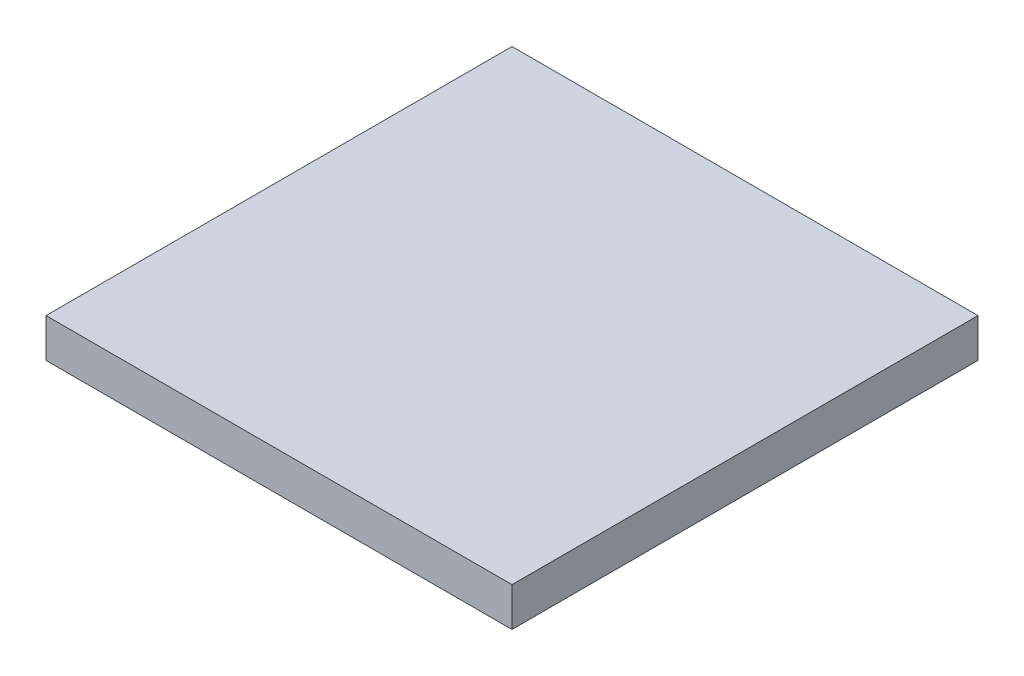
ISO-10303-21;
HEADER;
FILE_DESCRIPTION(('STEP AP214'),'2;1');
FILE_NAME('part.step','',(''),(''),'','','');
FILE_SCHEMA(('AUTOMOTIVE_DESIGN { 1 0 10303 214 1 1 1 1 }'));
ENDSEC;
DATA;
#1=APPLICATION_CONTEXT('core data for automotive mechanical design processes');
#2=APPLICATION_PROTOCOL_DEFINITION('international standard','automotive_design',2000,#1);
#3=PRODUCT_CONTEXT('',#1,'mechanical');
#4=PRODUCT('Part','Part','',(#3));
#5=PRODUCT_RELATED_PRODUCT_CATEGORY('part','',(#4));
#6=PRODUCT_DEFINITION_FORMATION('','',#4);
#7=PRODUCT_DEFINITION_CONTEXT('part definition',#1,'design');
#8=PRODUCT_DEFINITION('design','',#6,#7);
#9=PRODUCT_DEFINITION_SHAPE('','',#8);
#10=(LENGTH_UNIT() NAMED_UNIT(*) SI_UNIT(.MILLI.,.METRE.));
#11=(NAMED_UNIT(*) PLANE_ANGLE_UNIT() SI_UNIT($,.RADIAN.));
#12=(NAMED_UNIT(*) SI_UNIT($,.STERADIAN.) SOLID_ANGLE_UNIT());
#13=UNCERTAINTY_MEASURE_WITH_UNIT(LENGTH_MEASURE(1.E-05),#10,'distance_accuracy_value','');
#14=(GEOMETRIC_REPRESENTATION_CONTEXT(3) GLOBAL_UNCERTAINTY_ASSIGNED_CONTEXT((#13)) GLOBAL_UNIT_ASSIGNED_CONTEXT((#10,
#11,#12)) REPRESENTATION_CONTEXT('',''));
#15=CARTESIAN_POINT('',(0.,0.,0.));
#16=DIRECTION('',(0.,0.,1.));
#17=DIRECTION('',(1.,0.,0.));
#18=AXIS2_PLACEMENT_3D('',#15,#16,#17);
#19=CARTESIAN_POINT('',(-3.,0.5,3.));
#20=DIRECTION('',(1.,0.,0.));
#21=DIRECTION('',(0.,0.,-1.));
#22=AXIS2_PLACEMENT_3D('',#19,#20,#21);
#23=PLANE('',#22);
#24=DIRECTION('',(0.,0.,1.));
#25=VECTOR('',#24,1.);
#26=CARTESIAN_POINT('',(-3.,0.,3.));
#27=LINE('',#26,#25);
#28=CARTESIAN_POINT('',(-3.,0.,-3.));
#29=VERTEX_POINT('',#28);
#30=CARTESIAN_POINT('',(-3.,0.,3.));
#31=VERTEX_POINT('',#30);
#32=EDGE_CURVE('E96',#29,#31,#27,.T.);
#33=ORIENTED_EDGE('',*,*,#32,.T.);
#34=DIRECTION('',(0.,-1.,0.));
#35=VECTOR('',#34,1.);
#36=CARTESIAN_POINT('',(-3.,0.5,3.));
#37=LINE('',#36,#35);
#38=CARTESIAN_POINT('',(-3.,0.5,3.));
#39=VERTEX_POINT('',#38);
#40=EDGE_CURVE('E11',#39,#31,#37,.T.);
#41=ORIENTED_EDGE('',*,*,#40,.F.);
#42=DIRECTION('',(0.,0.,1.));
#43=VECTOR('',#42,1.);
#44=CARTESIAN_POINT('',(-3.,0.5,3.));
#45=LINE('',#44,#43);
#46=CARTESIAN_POINT('',(-3.,0.5,-3.));
#47=VERTEX_POINT('',#46);
#48=EDGE_CURVE('E84',#47,#39,#45,.T.);
#49=ORIENTED_EDGE('',*,*,#48,.F.);
#50=DIRECTION('',(0.,-1.,0.));
#51=VECTOR('',#50,1.);
#52=CARTESIAN_POINT('',(-3.,0.5,-3.));
#53=LINE('',#52,#51);
#54=EDGE_CURVE('E92',#47,#29,#53,.T.);
#55=ORIENTED_EDGE('',*,*,#54,.T.);
#56=EDGE_LOOP('',(#33,#41,#49,#55));
#57=FACE_BOUND('',#56,.T.);
#58=ADVANCED_FACE('F33',(#57),#23,.F.);
#59=CARTESIAN_POINT('',(3.,0.5,3.));
#60=DIRECTION('',(0.,0.,-1.));
#61=DIRECTION('',(-1.,0.,0.));
#62=AXIS2_PLACEMENT_3D('',#59,#60,#61);
#63=PLANE('',#62);
#64=DIRECTION('',(1.,0.,0.));
#65=VECTOR('',#64,1.);
#66=CARTESIAN_POINT('',(3.,0.,3.));
#67=LINE('',#66,#65);
#68=CARTESIAN_POINT('',(3.,0.,3.));
#69=VERTEX_POINT('',#68);
#70=EDGE_CURVE('E88',#31,#69,#67,.T.);
#71=ORIENTED_EDGE('',*,*,#70,.T.);
#72=DIRECTION('',(0.,-1.,0.));
#73=VECTOR('',#72,1.);
#74=CARTESIAN_POINT('',(3.,0.5,3.));
#75=LINE('',#74,#73);
#76=CARTESIAN_POINT('',(3.,0.5,3.));
#77=VERTEX_POINT('',#76);
#78=EDGE_CURVE('E41',#77,#69,#75,.T.);
#79=ORIENTED_EDGE('',*,*,#78,.F.);
#80=DIRECTION('',(1.,0.,0.));
#81=VECTOR('',#80,1.);
#82=CARTESIAN_POINT('',(3.,0.5,3.));
#83=LINE('',#82,#81);
#84=EDGE_CURVE('E79',#39,#77,#83,.T.);
#85=ORIENTED_EDGE('',*,*,#84,.F.);
#86=ORIENTED_EDGE('',*,*,#40,.T.);
#87=EDGE_LOOP('',(#71,#79,#85,#86));
#88=FACE_BOUND('',#87,.T.);
#89=ADVANCED_FACE('F87',(#88),#63,.F.);
#90=CARTESIAN_POINT('',(3.,0.5,3.));
#91=DIRECTION('',(-1.,0.,0.));
#92=DIRECTION('',(0.,0.,1.));
#93=AXIS2_PLACEMENT_3D('',#90,#91,#92);
#94=PLANE('',#93);
#95=DIRECTION('',(0.,0.,-1.));
#96=VECTOR('',#95,1.);
#97=CARTESIAN_POINT('',(3.,0.,3.));
#98=LINE('',#97,#96);
#99=CARTESIAN_POINT('',(3.,0.,-3.));
#100=VERTEX_POINT('',#99);
#101=EDGE_CURVE('E66',#69,#100,#98,.T.);
#102=ORIENTED_EDGE('',*,*,#101,.T.);
#103=DIRECTION('',(0.,-1.,0.));
#104=VECTOR('',#103,1.);
#105=CARTESIAN_POINT('',(3.,0.5,-3.));
#106=LINE('',#105,#104);
#107=CARTESIAN_POINT('',(3.,0.5,-3.));
#108=VERTEX_POINT('',#107);
#109=EDGE_CURVE('E89',#108,#100,#106,.T.);
#110=ORIENTED_EDGE('',*,*,#109,.F.);
#111=DIRECTION('',(0.,0.,-1.));
#112=VECTOR('',#111,1.);
#113=CARTESIAN_POINT('',(3.,0.5,3.));
#114=LINE('',#113,#112);
#115=EDGE_CURVE('E82',#77,#108,#114,.T.);
#116=ORIENTED_EDGE('',*,*,#115,.F.);
#117=ORIENTED_EDGE('',*,*,#78,.T.);
#118=EDGE_LOOP('',(#102,#110,#116,#117));
#119=FACE_BOUND('',#118,.T.);
#120=ADVANCED_FACE('F90',(#119),#94,.F.);
#121=CARTESIAN_POINT('',(3.,0.5,-3.));
#122=DIRECTION('',(0.,0.,1.));
#123=DIRECTION('',(1.,0.,0.));
#124=AXIS2_PLACEMENT_3D('',#121,#122,#123);
#125=PLANE('',#124);
#126=DIRECTION('',(-1.,0.,0.));
#127=VECTOR('',#126,1.);
#128=CARTESIAN_POINT('',(3.,0.,-3.));
#129=LINE('',#128,#127);
#130=EDGE_CURVE('E72',#100,#29,#129,.T.);
#131=ORIENTED_EDGE('',*,*,#130,.T.);
#132=ORIENTED_EDGE('',*,*,#54,.F.);
#133=DIRECTION('',(-1.,0.,0.));
#134=VECTOR('',#133,1.);
#135=CARTESIAN_POINT('',(3.,0.5,-3.));
#136=LINE('',#135,#134);
#137=EDGE_CURVE('E49',#108,#47,#136,.T.);
#138=ORIENTED_EDGE('',*,*,#137,.F.);
#139=ORIENTED_EDGE('',*,*,#109,.T.);
#140=EDGE_LOOP('',(#131,#132,#138,#139));
#141=FACE_BOUND('',#140,.T.);
#142=ADVANCED_FACE('F103',(#141),#125,.F.);
#143=CARTESIAN_POINT('',(0.,0.5,0.));
#144=DIRECTION('',(0.,1.,0.));
#145=DIRECTION('',(0.,0.,1.));
#146=AXIS2_PLACEMENT_3D('',#143,#144,#145);
#147=PLANE('',#146);
#148=ORIENTED_EDGE('',*,*,#48,.T.);
#149=ORIENTED_EDGE('',*,*,#84,.T.);
#150=ORIENTED_EDGE('',*,*,#115,.T.);
#151=ORIENTED_EDGE('',*,*,#137,.T.);
#152=EDGE_LOOP('',(#148,#149,#150,#151));
#153=FACE_BOUND('',#152,.T.);
#154=ADVANCED_FACE('F80',(#153),#147,.T.);
#155=CARTESIAN_POINT('',(0.,0.,0.));
#156=DIRECTION('',(0.,1.,0.));
#157=DIRECTION('',(0.,0.,1.));
#158=AXIS2_PLACEMENT_3D('',#155,#156,#157);
#159=PLANE('',#158);
#160=ORIENTED_EDGE('',*,*,#32,.F.);
#161=ORIENTED_EDGE('',*,*,#130,.F.);
#162=ORIENTED_EDGE('',*,*,#101,.F.);
#163=ORIENTED_EDGE('',*,*,#70,.F.);
#164=EDGE_LOOP('',(#160,#161,#162,#163));
#165=FACE_BOUND('',#164,.T.);
#166=ADVANCED_FACE('F106',(#165),#159,.F.);
#167=CLOSED_SHELL('',(#58,#89,#120,#142,#154,#166));
#168=MANIFOLD_SOLID_BREP('B2',#167);
#169=ADVANCED_BREP_SHAPE_REPRESENTATION('',(#18,#168),#14);
#170=SHAPE_DEFINITION_REPRESENTATION(#9,#169);
ENDSEC;
END-ISO-10303-21;
